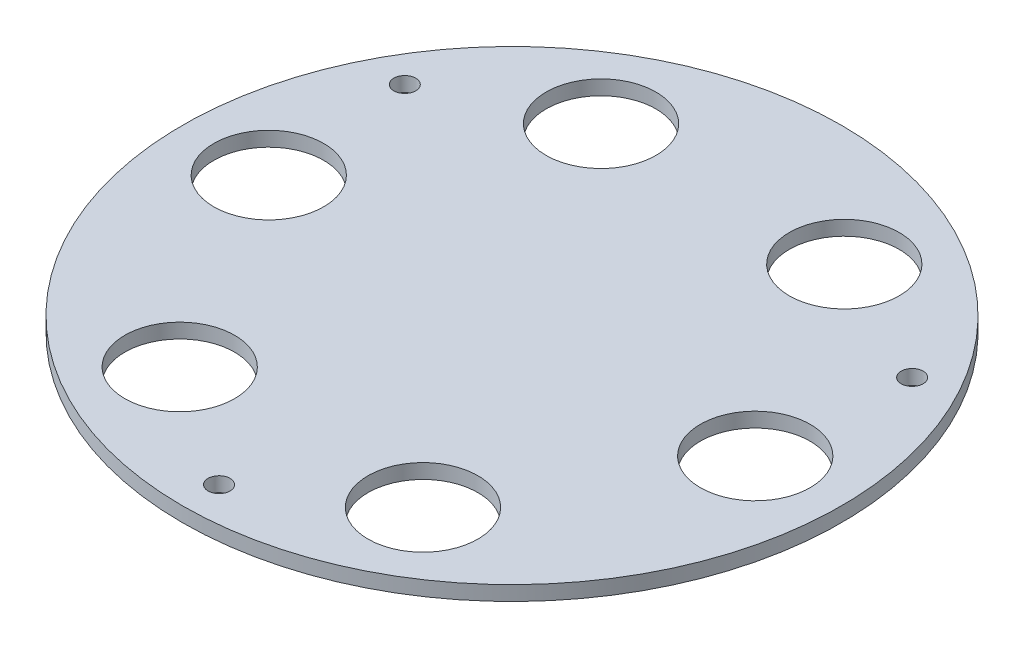
ISO-10303-21;
HEADER;
FILE_DESCRIPTION(('STEP AP214'),'2;1');
FILE_NAME('part.step','',(''),(''),'','','');
FILE_SCHEMA(('AUTOMOTIVE_DESIGN { 1 0 10303 214 1 1 1 1 }'));
ENDSEC;
DATA;
#1=APPLICATION_CONTEXT('core data for automotive mechanical design processes');
#2=APPLICATION_PROTOCOL_DEFINITION('international standard','automotive_design',2000,#1);
#3=PRODUCT_CONTEXT('',#1,'mechanical');
#4=PRODUCT('Part','Part','',(#3));
#5=PRODUCT_RELATED_PRODUCT_CATEGORY('part','',(#4));
#6=PRODUCT_DEFINITION_FORMATION('','',#4);
#7=PRODUCT_DEFINITION_CONTEXT('part definition',#1,'design');
#8=PRODUCT_DEFINITION('design','',#6,#7);
#9=PRODUCT_DEFINITION_SHAPE('','',#8);
#10=(LENGTH_UNIT() NAMED_UNIT(*) SI_UNIT(.MILLI.,.METRE.));
#11=(NAMED_UNIT(*) PLANE_ANGLE_UNIT() SI_UNIT($,.RADIAN.));
#12=(NAMED_UNIT(*) SI_UNIT($,.STERADIAN.) SOLID_ANGLE_UNIT());
#13=UNCERTAINTY_MEASURE_WITH_UNIT(LENGTH_MEASURE(1.E-05),#10,'distance_accuracy_value','');
#14=(GEOMETRIC_REPRESENTATION_CONTEXT(3) GLOBAL_UNCERTAINTY_ASSIGNED_CONTEXT((#13)) GLOBAL_UNIT_ASSIGNED_CONTEXT((#10,
#11,#12)) REPRESENTATION_CONTEXT('',''));
#15=CARTESIAN_POINT('',(0.,0.,0.));
#16=DIRECTION('',(0.,0.,1.));
#17=DIRECTION('',(1.,0.,0.));
#18=AXIS2_PLACEMENT_3D('',#15,#16,#17);
#19=CARTESIAN_POINT('',(0.,-1.99999999999999,0.));
#20=DIRECTION('',(0.,1.,0.));
#21=DIRECTION('',(0.,0.,1.));
#22=AXIS2_PLACEMENT_3D('',#19,#20,#21);
#23=CYLINDRICAL_SURFACE('',#22,45.);
#24=CARTESIAN_POINT('',(0.,-1.99999999999999,0.));
#25=DIRECTION('',(0.,1.,0.));
#26=DIRECTION('',(0.,0.,1.));
#27=AXIS2_PLACEMENT_3D('',#24,#25,#26);
#28=CIRCLE('',#27,45.);
#29=CARTESIAN_POINT('',(0.,-1.99999999999999,45.));
#30=VERTEX_POINT('',#29);
#31=EDGE_CURVE('E12',#30,#30,#28,.T.);
#32=ORIENTED_EDGE('',*,*,#31,.T.);
#33=EDGE_LOOP('',(#32));
#34=FACE_BOUND('',#33,.T.);
#35=CARTESIAN_POINT('',(0.,0.,0.));
#36=DIRECTION('',(0.,1.,0.));
#37=DIRECTION('',(0.,0.,1.));
#38=AXIS2_PLACEMENT_3D('',#35,#36,#37);
#39=CIRCLE('',#38,45.);
#40=CARTESIAN_POINT('',(0.,0.,45.));
#41=VERTEX_POINT('',#40);
#42=EDGE_CURVE('E45',#41,#41,#39,.T.);
#43=ORIENTED_EDGE('',*,*,#42,.F.);
#44=EDGE_LOOP('',(#43));
#45=FACE_BOUND('',#44,.T.);
#46=ADVANCED_FACE('F42',(#34,#45),#23,.T.);
#47=CARTESIAN_POINT('',(0.,-1.99999999999999,0.));
#48=DIRECTION('',(0.,1.,0.));
#49=DIRECTION('',(0.,0.,1.));
#50=AXIS2_PLACEMENT_3D('',#47,#48,#49);
#51=PLANE('',#50);
#52=CARTESIAN_POINT('',(-34.6410161513775,-1.99999999999999,-20.0000000000001));
#53=DIRECTION('',(0.,1.,0.));
#54=DIRECTION('',(0.,0.,1.));
#55=AXIS2_PLACEMENT_3D('',#52,#53,#54);
#56=CIRCLE('',#55,1.5);
#57=CARTESIAN_POINT('',(-34.6410161513775,-1.99999999999999,-18.5000000000001));
#58=VERTEX_POINT('',#57);
#59=EDGE_CURVE('E101',#58,#58,#56,.T.);
#60=ORIENTED_EDGE('',*,*,#59,.T.);
#61=EDGE_LOOP('',(#60));
#62=FACE_BOUND('',#61,.T.);
#63=CARTESIAN_POINT('',(0.,-1.99999999999999,40.));
#64=DIRECTION('',(0.,1.,0.));
#65=DIRECTION('',(0.,0.,1.));
#66=AXIS2_PLACEMENT_3D('',#63,#64,#65);
#67=CIRCLE('',#66,1.5);
#68=CARTESIAN_POINT('',(0.,-1.99999999999999,41.5));
#69=VERTEX_POINT('',#68);
#70=EDGE_CURVE('E95',#69,#69,#67,.T.);
#71=ORIENTED_EDGE('',*,*,#70,.T.);
#72=EDGE_LOOP('',(#71));
#73=FACE_BOUND('',#72,.T.);
#74=CARTESIAN_POINT('',(34.6410161513774,-1.99999999999999,-20.0000000000002));
#75=DIRECTION('',(0.,1.,0.));
#76=DIRECTION('',(0.,0.,1.));
#77=AXIS2_PLACEMENT_3D('',#74,#75,#76);
#78=CIRCLE('',#77,1.5);
#79=CARTESIAN_POINT('',(34.6410161513774,-1.99999999999999,-18.5000000000002));
#80=VERTEX_POINT('',#79);
#81=EDGE_CURVE('E89',#80,#80,#78,.T.);
#82=ORIENTED_EDGE('',*,*,#81,.T.);
#83=EDGE_LOOP('',(#82));
#84=FACE_BOUND('',#83,.T.);
#85=CARTESIAN_POINT('',(-16.6069719430113,-1.99999999999999,-28.7641191651665));
#86=DIRECTION('',(0.,1.,0.));
#87=DIRECTION('',(0.,0.,1.));
#88=AXIS2_PLACEMENT_3D('',#85,#86,#87);
#89=CIRCLE('',#88,7.5);
#90=CARTESIAN_POINT('',(-16.6069719430113,-1.99999999999999,-21.2641191651665));
#91=VERTEX_POINT('',#90);
#92=EDGE_CURVE('E83',#91,#91,#89,.T.);
#93=ORIENTED_EDGE('',*,*,#92,.T.);
#94=EDGE_LOOP('',(#93));
#95=FACE_BOUND('',#94,.T.);
#96=CARTESIAN_POINT('',(-16.6069719430113,-1.99999999999999,28.7641191651665));
#97=DIRECTION('',(0.,1.,0.));
#98=DIRECTION('',(0.,0.,1.));
#99=AXIS2_PLACEMENT_3D('',#96,#97,#98);
#100=CIRCLE('',#99,7.5);
#101=CARTESIAN_POINT('',(-16.6069719430113,-1.99999999999999,36.2641191651665));
#102=VERTEX_POINT('',#101);
#103=EDGE_CURVE('E77',#102,#102,#100,.T.);
#104=ORIENTED_EDGE('',*,*,#103,.T.);
#105=EDGE_LOOP('',(#104));
#106=FACE_BOUND('',#105,.T.);
#107=CARTESIAN_POINT('',(33.2139438860227,-1.99999999999999,-2.52592963899962E-13));
#108=DIRECTION('',(0.,1.,0.));
#109=DIRECTION('',(0.,0.,1.));
#110=AXIS2_PLACEMENT_3D('',#107,#108,#109);
#111=CIRCLE('',#110,7.5);
#112=CARTESIAN_POINT('',(33.2139438860227,-1.99999999999999,7.49999999999975));
#113=VERTEX_POINT('',#112);
#114=EDGE_CURVE('E71',#113,#113,#111,.T.);
#115=ORIENTED_EDGE('',*,*,#114,.T.);
#116=EDGE_LOOP('',(#115));
#117=FACE_BOUND('',#116,.T.);
#118=CARTESIAN_POINT('',(16.6069719430115,-1.99999999999999,-28.7641191651664));
#119=DIRECTION('',(0.,1.,0.));
#120=DIRECTION('',(0.,0.,1.));
#121=AXIS2_PLACEMENT_3D('',#118,#119,#120);
#122=CIRCLE('',#121,7.5);
#123=CARTESIAN_POINT('',(16.6069719430115,-1.99999999999999,-21.2641191651664));
#124=VERTEX_POINT('',#123);
#125=EDGE_CURVE('E65',#124,#124,#122,.T.);
#126=ORIENTED_EDGE('',*,*,#125,.T.);
#127=EDGE_LOOP('',(#126));
#128=FACE_BOUND('',#127,.T.);
#129=CARTESIAN_POINT('',(16.6069719430115,-1.99999999999999,28.7641191651664));
#130=DIRECTION('',(0.,1.,0.));
#131=DIRECTION('',(0.,0.,1.));
#132=AXIS2_PLACEMENT_3D('',#129,#130,#131);
#133=CIRCLE('',#132,7.5);
#134=CARTESIAN_POINT('',(16.6069719430115,-1.99999999999999,36.2641191651664));
#135=VERTEX_POINT('',#134);
#136=EDGE_CURVE('E59',#135,#135,#133,.T.);
#137=ORIENTED_EDGE('',*,*,#136,.T.);
#138=EDGE_LOOP('',(#137));
#139=FACE_BOUND('',#138,.T.);
#140=CARTESIAN_POINT('',(-33.2139438860227,-1.99999999999999,0.));
#141=DIRECTION('',(0.,1.,0.));
#142=DIRECTION('',(0.,0.,1.));
#143=AXIS2_PLACEMENT_3D('',#140,#141,#142);
#144=CIRCLE('',#143,7.5);
#145=CARTESIAN_POINT('',(-33.2139438860227,-1.99999999999999,7.5));
#146=VERTEX_POINT('',#145);
#147=EDGE_CURVE('E52',#146,#146,#144,.T.);
#148=ORIENTED_EDGE('',*,*,#147,.T.);
#149=EDGE_LOOP('',(#148));
#150=FACE_BOUND('',#149,.T.);
#151=ORIENTED_EDGE('',*,*,#31,.F.);
#152=EDGE_LOOP('',(#151));
#153=FACE_BOUND('',#152,.T.);
#154=ADVANCED_FACE('F114',(#62,#73,#84,#95,#106,#117,#128,#139,#150,#153),#51,.F.);
#155=CARTESIAN_POINT('',(0.,0.,0.));
#156=DIRECTION('',(0.,1.,0.));
#157=DIRECTION('',(0.,0.,1.));
#158=AXIS2_PLACEMENT_3D('',#155,#156,#157);
#159=PLANE('',#158);
#160=CARTESIAN_POINT('',(-34.6410161513775,0.,-20.0000000000001));
#161=DIRECTION('',(0.,1.,0.));
#162=DIRECTION('',(0.,0.,1.));
#163=AXIS2_PLACEMENT_3D('',#160,#161,#162);
#164=CIRCLE('',#163,1.49999999999999);
#165=CARTESIAN_POINT('',(-34.6410161513775,0.,-18.5000000000001));
#166=VERTEX_POINT('',#165);
#167=EDGE_CURVE('E104',#166,#166,#164,.T.);
#168=ORIENTED_EDGE('',*,*,#167,.F.);
#169=EDGE_LOOP('',(#168));
#170=FACE_BOUND('',#169,.T.);
#171=CARTESIAN_POINT('',(0.,0.,40.));
#172=DIRECTION('',(0.,1.,0.));
#173=DIRECTION('',(0.,0.,1.));
#174=AXIS2_PLACEMENT_3D('',#171,#172,#173);
#175=CIRCLE('',#174,1.49999999999999);
#176=CARTESIAN_POINT('',(0.,0.,41.5));
#177=VERTEX_POINT('',#176);
#178=EDGE_CURVE('E98',#177,#177,#175,.T.);
#179=ORIENTED_EDGE('',*,*,#178,.F.);
#180=EDGE_LOOP('',(#179));
#181=FACE_BOUND('',#180,.T.);
#182=CARTESIAN_POINT('',(34.6410161513774,0.,-20.0000000000002));
#183=DIRECTION('',(0.,1.,0.));
#184=DIRECTION('',(0.,0.,1.));
#185=AXIS2_PLACEMENT_3D('',#182,#183,#184);
#186=CIRCLE('',#185,1.49999999999999);
#187=CARTESIAN_POINT('',(34.6410161513774,0.,-18.5000000000002));
#188=VERTEX_POINT('',#187);
#189=EDGE_CURVE('E92',#188,#188,#186,.T.);
#190=ORIENTED_EDGE('',*,*,#189,.F.);
#191=EDGE_LOOP('',(#190));
#192=FACE_BOUND('',#191,.T.);
#193=CARTESIAN_POINT('',(-16.6069719430113,0.,-28.7641191651665));
#194=DIRECTION('',(0.,1.,0.));
#195=DIRECTION('',(0.,0.,1.));
#196=AXIS2_PLACEMENT_3D('',#193,#194,#195);
#197=CIRCLE('',#196,7.5);
#198=CARTESIAN_POINT('',(-16.6069719430113,0.,-21.2641191651665));
#199=VERTEX_POINT('',#198);
#200=EDGE_CURVE('E86',#199,#199,#197,.T.);
#201=ORIENTED_EDGE('',*,*,#200,.F.);
#202=EDGE_LOOP('',(#201));
#203=FACE_BOUND('',#202,.T.);
#204=CARTESIAN_POINT('',(-16.6069719430113,0.,28.7641191651665));
#205=DIRECTION('',(0.,1.,0.));
#206=DIRECTION('',(0.,0.,1.));
#207=AXIS2_PLACEMENT_3D('',#204,#205,#206);
#208=CIRCLE('',#207,7.5);
#209=CARTESIAN_POINT('',(-16.6069719430113,0.,36.2641191651665));
#210=VERTEX_POINT('',#209);
#211=EDGE_CURVE('E80',#210,#210,#208,.T.);
#212=ORIENTED_EDGE('',*,*,#211,.F.);
#213=EDGE_LOOP('',(#212));
#214=FACE_BOUND('',#213,.T.);
#215=CARTESIAN_POINT('',(33.2139438860227,0.,-2.52592963899962E-13));
#216=DIRECTION('',(0.,1.,0.));
#217=DIRECTION('',(0.,0.,1.));
#218=AXIS2_PLACEMENT_3D('',#215,#216,#217);
#219=CIRCLE('',#218,7.5);
#220=CARTESIAN_POINT('',(33.2139438860227,0.,7.49999999999975));
#221=VERTEX_POINT('',#220);
#222=EDGE_CURVE('E74',#221,#221,#219,.T.);
#223=ORIENTED_EDGE('',*,*,#222,.F.);
#224=EDGE_LOOP('',(#223));
#225=FACE_BOUND('',#224,.T.);
#226=CARTESIAN_POINT('',(16.6069719430115,0.,-28.7641191651664));
#227=DIRECTION('',(0.,1.,0.));
#228=DIRECTION('',(0.,0.,1.));
#229=AXIS2_PLACEMENT_3D('',#226,#227,#228);
#230=CIRCLE('',#229,7.5);
#231=CARTESIAN_POINT('',(16.6069719430115,0.,-21.2641191651664));
#232=VERTEX_POINT('',#231);
#233=EDGE_CURVE('E68',#232,#232,#230,.T.);
#234=ORIENTED_EDGE('',*,*,#233,.F.);
#235=EDGE_LOOP('',(#234));
#236=FACE_BOUND('',#235,.T.);
#237=CARTESIAN_POINT('',(16.6069719430115,0.,28.7641191651664));
#238=DIRECTION('',(0.,1.,0.));
#239=DIRECTION('',(0.,0.,1.));
#240=AXIS2_PLACEMENT_3D('',#237,#238,#239);
#241=CIRCLE('',#240,7.5);
#242=CARTESIAN_POINT('',(16.6069719430115,0.,36.2641191651664));
#243=VERTEX_POINT('',#242);
#244=EDGE_CURVE('E62',#243,#243,#241,.T.);
#245=ORIENTED_EDGE('',*,*,#244,.F.);
#246=EDGE_LOOP('',(#245));
#247=FACE_BOUND('',#246,.T.);
#248=CARTESIAN_POINT('',(-33.2139438860227,0.,0.));
#249=DIRECTION('',(0.,1.,0.));
#250=DIRECTION('',(0.,0.,1.));
#251=AXIS2_PLACEMENT_3D('',#248,#249,#250);
#252=CIRCLE('',#251,7.5);
#253=CARTESIAN_POINT('',(-33.2139438860227,0.,7.5));
#254=VERTEX_POINT('',#253);
#255=EDGE_CURVE('E56',#254,#254,#252,.T.);
#256=ORIENTED_EDGE('',*,*,#255,.F.);
#257=EDGE_LOOP('',(#256));
#258=FACE_BOUND('',#257,.T.);
#259=ORIENTED_EDGE('',*,*,#42,.T.);
#260=EDGE_LOOP('',(#259));
#261=FACE_BOUND('',#260,.T.);
#262=ADVANCED_FACE('F110',(#170,#181,#192,#203,#214,#225,#236,#247,#258,#261),#159,.T.);
#263=CARTESIAN_POINT('',(-33.2139438860227,0.,0.));
#264=DIRECTION('',(0.,1.,0.));
#265=DIRECTION('',(0.,0.,1.));
#266=AXIS2_PLACEMENT_3D('',#263,#264,#265);
#267=CYLINDRICAL_SURFACE('',#266,7.5);
#268=ORIENTED_EDGE('',*,*,#147,.F.);
#269=EDGE_LOOP('',(#268));
#270=FACE_BOUND('',#269,.T.);
#271=ORIENTED_EDGE('',*,*,#255,.T.);
#272=EDGE_LOOP('',(#271));
#273=FACE_BOUND('',#272,.T.);
#274=ADVANCED_FACE('F113',(#270,#273),#267,.F.);
#275=CARTESIAN_POINT('',(16.6069719430115,0.,28.7641191651664));
#276=DIRECTION('',(0.,1.,0.));
#277=DIRECTION('',(0.,0.,1.));
#278=AXIS2_PLACEMENT_3D('',#275,#276,#277);
#279=CYLINDRICAL_SURFACE('',#278,7.5);
#280=ORIENTED_EDGE('',*,*,#136,.F.);
#281=EDGE_LOOP('',(#280));
#282=FACE_BOUND('',#281,.T.);
#283=ORIENTED_EDGE('',*,*,#244,.T.);
#284=EDGE_LOOP('',(#283));
#285=FACE_BOUND('',#284,.T.);
#286=ADVANCED_FACE('F145',(#282,#285),#279,.F.);
#287=CARTESIAN_POINT('',(16.6069719430115,0.,-28.7641191651664));
#288=DIRECTION('',(0.,1.,0.));
#289=DIRECTION('',(0.,0.,1.));
#290=AXIS2_PLACEMENT_3D('',#287,#288,#289);
#291=CYLINDRICAL_SURFACE('',#290,7.5);
#292=ORIENTED_EDGE('',*,*,#125,.F.);
#293=EDGE_LOOP('',(#292));
#294=FACE_BOUND('',#293,.T.);
#295=ORIENTED_EDGE('',*,*,#233,.T.);
#296=EDGE_LOOP('',(#295));
#297=FACE_BOUND('',#296,.T.);
#298=ADVANCED_FACE('F149',(#294,#297),#291,.F.);
#299=CARTESIAN_POINT('',(33.2139438860227,0.,-2.52592963899962E-13));
#300=DIRECTION('',(0.,1.,0.));
#301=DIRECTION('',(0.,0.,1.));
#302=AXIS2_PLACEMENT_3D('',#299,#300,#301);
#303=CYLINDRICAL_SURFACE('',#302,7.5);
#304=ORIENTED_EDGE('',*,*,#114,.F.);
#305=EDGE_LOOP('',(#304));
#306=FACE_BOUND('',#305,.T.);
#307=ORIENTED_EDGE('',*,*,#222,.T.);
#308=EDGE_LOOP('',(#307));
#309=FACE_BOUND('',#308,.T.);
#310=ADVANCED_FACE('F153',(#306,#309),#303,.F.);
#311=CARTESIAN_POINT('',(-16.6069719430113,0.,28.7641191651665));
#312=DIRECTION('',(0.,1.,0.));
#313=DIRECTION('',(0.,0.,1.));
#314=AXIS2_PLACEMENT_3D('',#311,#312,#313);
#315=CYLINDRICAL_SURFACE('',#314,7.5);
#316=ORIENTED_EDGE('',*,*,#103,.F.);
#317=EDGE_LOOP('',(#316));
#318=FACE_BOUND('',#317,.T.);
#319=ORIENTED_EDGE('',*,*,#211,.T.);
#320=EDGE_LOOP('',(#319));
#321=FACE_BOUND('',#320,.T.);
#322=ADVANCED_FACE('F157',(#318,#321),#315,.F.);
#323=CARTESIAN_POINT('',(-16.6069719430113,0.,-28.7641191651665));
#324=DIRECTION('',(0.,1.,0.));
#325=DIRECTION('',(0.,0.,1.));
#326=AXIS2_PLACEMENT_3D('',#323,#324,#325);
#327=CYLINDRICAL_SURFACE('',#326,7.5);
#328=ORIENTED_EDGE('',*,*,#92,.F.);
#329=EDGE_LOOP('',(#328));
#330=FACE_BOUND('',#329,.T.);
#331=ORIENTED_EDGE('',*,*,#200,.T.);
#332=EDGE_LOOP('',(#331));
#333=FACE_BOUND('',#332,.T.);
#334=ADVANCED_FACE('F161',(#330,#333),#327,.F.);
#335=CARTESIAN_POINT('',(34.6410161513774,0.,-20.0000000000002));
#336=DIRECTION('',(0.,1.,0.));
#337=DIRECTION('',(0.,0.,1.));
#338=AXIS2_PLACEMENT_3D('',#335,#336,#337);
#339=CYLINDRICAL_SURFACE('',#338,1.49999999999999);
#340=ORIENTED_EDGE('',*,*,#81,.F.);
#341=EDGE_LOOP('',(#340));
#342=FACE_BOUND('',#341,.T.);
#343=ORIENTED_EDGE('',*,*,#189,.T.);
#344=EDGE_LOOP('',(#343));
#345=FACE_BOUND('',#344,.T.);
#346=ADVANCED_FACE('F165',(#342,#345),#339,.F.);
#347=CARTESIAN_POINT('',(0.,0.,40.));
#348=DIRECTION('',(0.,1.,0.));
#349=DIRECTION('',(0.,0.,1.));
#350=AXIS2_PLACEMENT_3D('',#347,#348,#349);
#351=CYLINDRICAL_SURFACE('',#350,1.49999999999999);
#352=ORIENTED_EDGE('',*,*,#70,.F.);
#353=EDGE_LOOP('',(#352));
#354=FACE_BOUND('',#353,.T.);
#355=ORIENTED_EDGE('',*,*,#178,.T.);
#356=EDGE_LOOP('',(#355));
#357=FACE_BOUND('',#356,.T.);
#358=ADVANCED_FACE('F169',(#354,#357),#351,.F.);
#359=CARTESIAN_POINT('',(-34.6410161513775,0.,-20.0000000000001));
#360=DIRECTION('',(0.,1.,0.));
#361=DIRECTION('',(0.,0.,1.));
#362=AXIS2_PLACEMENT_3D('',#359,#360,#361);
#363=CYLINDRICAL_SURFACE('',#362,1.49999999999999);
#364=ORIENTED_EDGE('',*,*,#59,.F.);
#365=EDGE_LOOP('',(#364));
#366=FACE_BOUND('',#365,.T.);
#367=ORIENTED_EDGE('',*,*,#167,.T.);
#368=EDGE_LOOP('',(#367));
#369=FACE_BOUND('',#368,.T.);
#370=ADVANCED_FACE('F108',(#366,#369),#363,.F.);
#371=CLOSED_SHELL('',(#46,#154,#262,#274,#286,#298,#310,#322,#334,#346,#358,#370));
#372=MANIFOLD_SOLID_BREP('B2',#371);
#373=ADVANCED_BREP_SHAPE_REPRESENTATION('',(#18,#372),#14);
#374=SHAPE_DEFINITION_REPRESENTATION(#9,#373);
ENDSEC;
END-ISO-10303-21;
